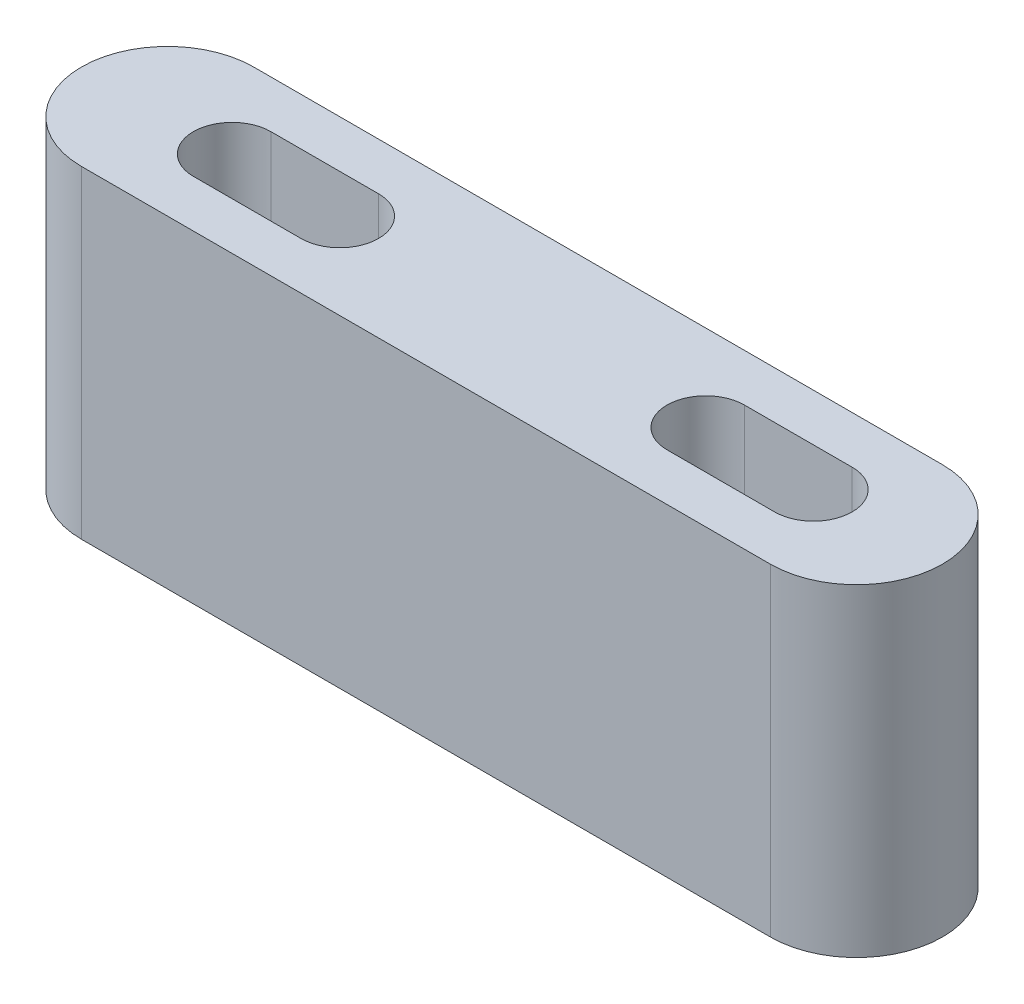
ISO-10303-21;
HEADER;
FILE_DESCRIPTION(('STEP AP214'),'2;1');
FILE_NAME('part.step','',(''),(''),'','','');
FILE_SCHEMA(('AUTOMOTIVE_DESIGN { 1 0 10303 214 1 1 1 1 }'));
ENDSEC;
DATA;
#1=APPLICATION_CONTEXT('core data for automotive mechanical design processes');
#2=APPLICATION_PROTOCOL_DEFINITION('international standard','automotive_design',2000,#1);
#3=PRODUCT_CONTEXT('',#1,'mechanical');
#4=PRODUCT('Part','Part','',(#3));
#5=PRODUCT_RELATED_PRODUCT_CATEGORY('part','',(#4));
#6=PRODUCT_DEFINITION_FORMATION('','',#4);
#7=PRODUCT_DEFINITION_CONTEXT('part definition',#1,'design');
#8=PRODUCT_DEFINITION('design','',#6,#7);
#9=PRODUCT_DEFINITION_SHAPE('','',#8);
#10=(LENGTH_UNIT() NAMED_UNIT(*) SI_UNIT(.MILLI.,.METRE.));
#11=(NAMED_UNIT(*) PLANE_ANGLE_UNIT() SI_UNIT($,.RADIAN.));
#12=(NAMED_UNIT(*) SI_UNIT($,.STERADIAN.) SOLID_ANGLE_UNIT());
#13=UNCERTAINTY_MEASURE_WITH_UNIT(LENGTH_MEASURE(1.E-05),#10,'distance_accuracy_value','');
#14=(GEOMETRIC_REPRESENTATION_CONTEXT(3) GLOBAL_UNCERTAINTY_ASSIGNED_CONTEXT((#13)) GLOBAL_UNIT_ASSIGNED_CONTEXT((#10,
#11,#12)) REPRESENTATION_CONTEXT('',''));
#15=CARTESIAN_POINT('',(0.,0.,0.));
#16=DIRECTION('',(0.,0.,1.));
#17=DIRECTION('',(1.,0.,0.));
#18=AXIS2_PLACEMENT_3D('',#15,#16,#17);
#19=CARTESIAN_POINT('',(0.,15.,-4.));
#20=DIRECTION('',(0.,-1.,0.));
#21=DIRECTION('',(0.,0.,-1.));
#22=AXIS2_PLACEMENT_3D('',#19,#20,#21);
#23=CYLINDRICAL_SURFACE('',#22,4.);
#24=CARTESIAN_POINT('',(0.,0.,-4.));
#25=DIRECTION('',(0.,1.,0.));
#26=DIRECTION('',(0.,0.,1.));
#27=AXIS2_PLACEMENT_3D('',#24,#25,#26);
#28=CIRCLE('',#27,4.);
#29=CARTESIAN_POINT('',(0.,0.,-8.));
#30=VERTEX_POINT('',#29);
#31=CARTESIAN_POINT('',(0.,0.,0.));
#32=VERTEX_POINT('',#31);
#33=EDGE_CURVE('E158',#30,#32,#28,.T.);
#34=ORIENTED_EDGE('',*,*,#33,.T.);
#35=DIRECTION('',(0.,-1.,0.));
#36=VECTOR('',#35,1.);
#37=CARTESIAN_POINT('',(0.,15.,0.));
#38=LINE('',#37,#36);
#39=CARTESIAN_POINT('',(0.,15.,0.));
#40=VERTEX_POINT('',#39);
#41=EDGE_CURVE('E11',#40,#32,#38,.T.);
#42=ORIENTED_EDGE('',*,*,#41,.F.);
#43=CARTESIAN_POINT('',(0.,15.,-4.));
#44=DIRECTION('',(0.,1.,0.));
#45=DIRECTION('',(0.,0.,1.));
#46=AXIS2_PLACEMENT_3D('',#43,#44,#45);
#47=CIRCLE('',#46,4.);
#48=CARTESIAN_POINT('',(0.,15.,-8.));
#49=VERTEX_POINT('',#48);
#50=EDGE_CURVE('E191',#49,#40,#47,.T.);
#51=ORIENTED_EDGE('',*,*,#50,.F.);
#52=DIRECTION('',(0.,-1.,0.));
#53=VECTOR('',#52,1.);
#54=CARTESIAN_POINT('',(0.,15.,-8.));
#55=LINE('',#54,#53);
#56=EDGE_CURVE('E201',#49,#30,#55,.T.);
#57=ORIENTED_EDGE('',*,*,#56,.T.);
#58=EDGE_LOOP('',(#34,#42,#51,#57));
#59=FACE_BOUND('',#58,.T.);
#60=ADVANCED_FACE('F33',(#59),#23,.T.);
#61=CARTESIAN_POINT('',(0.,15.,0.));
#62=DIRECTION('',(0.,0.,-1.));
#63=DIRECTION('',(-1.,0.,0.));
#64=AXIS2_PLACEMENT_3D('',#61,#62,#63);
#65=PLANE('',#64);
#66=DIRECTION('',(1.,0.,0.));
#67=VECTOR('',#66,1.);
#68=CARTESIAN_POINT('',(0.,0.,0.));
#69=LINE('',#68,#67);
#70=CARTESIAN_POINT('',(32.,0.,0.));
#71=VERTEX_POINT('',#70);
#72=EDGE_CURVE('E204',#32,#71,#69,.T.);
#73=ORIENTED_EDGE('',*,*,#72,.T.);
#74=DIRECTION('',(0.,-1.,0.));
#75=VECTOR('',#74,1.);
#76=CARTESIAN_POINT('',(32.,15.,0.));
#77=LINE('',#76,#75);
#78=CARTESIAN_POINT('',(32.,15.,0.));
#79=VERTEX_POINT('',#78);
#80=EDGE_CURVE('E40',#79,#71,#77,.T.);
#81=ORIENTED_EDGE('',*,*,#80,.F.);
#82=DIRECTION('',(1.,0.,0.));
#83=VECTOR('',#82,1.);
#84=CARTESIAN_POINT('',(0.,15.,0.));
#85=LINE('',#84,#83);
#86=EDGE_CURVE('E194',#40,#79,#85,.T.);
#87=ORIENTED_EDGE('',*,*,#86,.F.);
#88=ORIENTED_EDGE('',*,*,#41,.T.);
#89=EDGE_LOOP('',(#73,#81,#87,#88));
#90=FACE_BOUND('',#89,.T.);
#91=ADVANCED_FACE('F233',(#90),#65,.F.);
#92=CARTESIAN_POINT('',(32.,15.,-4.));
#93=DIRECTION('',(0.,-1.,0.));
#94=DIRECTION('',(0.,0.,-1.));
#95=AXIS2_PLACEMENT_3D('',#92,#93,#94);
#96=CYLINDRICAL_SURFACE('',#95,4.);
#97=CARTESIAN_POINT('',(32.,0.,-4.));
#98=DIRECTION('',(0.,1.,0.));
#99=DIRECTION('',(0.,0.,1.));
#100=AXIS2_PLACEMENT_3D('',#97,#98,#99);
#101=CIRCLE('',#100,4.);
#102=CARTESIAN_POINT('',(32.,0.,-8.));
#103=VERTEX_POINT('',#102);
#104=EDGE_CURVE('E206',#71,#103,#101,.T.);
#105=ORIENTED_EDGE('',*,*,#104,.T.);
#106=DIRECTION('',(0.,-1.,0.));
#107=VECTOR('',#106,1.);
#108=CARTESIAN_POINT('',(32.,15.,-8.));
#109=LINE('',#108,#107);
#110=CARTESIAN_POINT('',(32.,15.,-8.));
#111=VERTEX_POINT('',#110);
#112=EDGE_CURVE('E211',#111,#103,#109,.T.);
#113=ORIENTED_EDGE('',*,*,#112,.F.);
#114=CARTESIAN_POINT('',(32.,15.,-4.));
#115=DIRECTION('',(0.,1.,0.));
#116=DIRECTION('',(0.,0.,1.));
#117=AXIS2_PLACEMENT_3D('',#114,#115,#116);
#118=CIRCLE('',#117,4.);
#119=EDGE_CURVE('E197',#79,#111,#118,.T.);
#120=ORIENTED_EDGE('',*,*,#119,.F.);
#121=ORIENTED_EDGE('',*,*,#80,.T.);
#122=EDGE_LOOP('',(#105,#113,#120,#121));
#123=FACE_BOUND('',#122,.T.);
#124=ADVANCED_FACE('F218',(#123),#96,.T.);
#125=CARTESIAN_POINT('',(0.,15.,-8.));
#126=DIRECTION('',(0.,0.,1.));
#127=DIRECTION('',(1.,0.,0.));
#128=AXIS2_PLACEMENT_3D('',#125,#126,#127);
#129=PLANE('',#128);
#130=DIRECTION('',(-1.,0.,0.));
#131=VECTOR('',#130,1.);
#132=CARTESIAN_POINT('',(0.,0.,-8.));
#133=LINE('',#132,#131);
#134=EDGE_CURVE('E195',#103,#30,#133,.T.);
#135=ORIENTED_EDGE('',*,*,#134,.T.);
#136=ORIENTED_EDGE('',*,*,#56,.F.);
#137=DIRECTION('',(-1.,0.,0.));
#138=VECTOR('',#137,1.);
#139=CARTESIAN_POINT('',(0.,15.,-8.));
#140=LINE('',#139,#138);
#141=EDGE_CURVE('E199',#111,#49,#140,.T.);
#142=ORIENTED_EDGE('',*,*,#141,.F.);
#143=ORIENTED_EDGE('',*,*,#112,.T.);
#144=EDGE_LOOP('',(#135,#136,#142,#143));
#145=FACE_BOUND('',#144,.T.);
#146=ADVANCED_FACE('F226',(#145),#129,.F.);
#147=CARTESIAN_POINT('',(0.,15.,-4.));
#148=DIRECTION('',(0.,1.,0.));
#149=DIRECTION('',(0.,0.,1.));
#150=AXIS2_PLACEMENT_3D('',#147,#148,#149);
#151=PLANE('',#150);
#152=CARTESIAN_POINT('',(3.,15.,-4.));
#153=DIRECTION('',(0.,1.,0.));
#154=DIRECTION('',(0.,0.,1.));
#155=AXIS2_PLACEMENT_3D('',#152,#153,#154);
#156=CIRCLE('',#155,1.8);
#157=CARTESIAN_POINT('',(3.,15.,-5.8));
#158=VERTEX_POINT('',#157);
#159=CARTESIAN_POINT('',(3.,15.,-2.2));
#160=VERTEX_POINT('',#159);
#161=EDGE_CURVE('E47',#158,#160,#156,.T.);
#162=ORIENTED_EDGE('',*,*,#161,.F.);
#163=DIRECTION('',(-1.,0.,0.));
#164=VECTOR('',#163,1.);
#165=CARTESIAN_POINT('',(3.,15.,-5.8));
#166=LINE('',#165,#164);
#167=CARTESIAN_POINT('',(8.,15.,-5.8));
#168=VERTEX_POINT('',#167);
#169=EDGE_CURVE('E142',#168,#158,#166,.T.);
#170=ORIENTED_EDGE('',*,*,#169,.F.);
#171=CARTESIAN_POINT('',(8.,15.,-4.));
#172=DIRECTION('',(0.,1.,0.));
#173=DIRECTION('',(0.,0.,1.));
#174=AXIS2_PLACEMENT_3D('',#171,#172,#173);
#175=CIRCLE('',#174,1.8);
#176=CARTESIAN_POINT('',(8.,15.,-2.2));
#177=VERTEX_POINT('',#176);
#178=EDGE_CURVE('E145',#177,#168,#175,.T.);
#179=ORIENTED_EDGE('',*,*,#178,.F.);
#180=DIRECTION('',(1.,0.,0.));
#181=VECTOR('',#180,1.);
#182=CARTESIAN_POINT('',(3.,15.,-2.2));
#183=LINE('',#182,#181);
#184=EDGE_CURVE('E151',#160,#177,#183,.T.);
#185=ORIENTED_EDGE('',*,*,#184,.F.);
#186=EDGE_LOOP('',(#162,#170,#179,#185));
#187=FACE_BOUND('',#186,.T.);
#188=CARTESIAN_POINT('',(25.,15.,-4.));
#189=DIRECTION('',(0.,1.,0.));
#190=DIRECTION('',(0.,0.,1.));
#191=AXIS2_PLACEMENT_3D('',#188,#189,#190);
#192=CIRCLE('',#191,1.8);
#193=CARTESIAN_POINT('',(25.,15.,-5.8));
#194=VERTEX_POINT('',#193);
#195=CARTESIAN_POINT('',(25.,15.,-2.2));
#196=VERTEX_POINT('',#195);
#197=EDGE_CURVE('E55',#194,#196,#192,.T.);
#198=ORIENTED_EDGE('',*,*,#197,.F.);
#199=DIRECTION('',(-1.,0.,0.));
#200=VECTOR('',#199,1.);
#201=CARTESIAN_POINT('',(25.,15.,-5.8));
#202=LINE('',#201,#200);
#203=CARTESIAN_POINT('',(30.,15.,-5.8));
#204=VERTEX_POINT('',#203);
#205=EDGE_CURVE('E166',#204,#194,#202,.T.);
#206=ORIENTED_EDGE('',*,*,#205,.F.);
#207=CARTESIAN_POINT('',(30.,15.,-4.));
#208=DIRECTION('',(0.,1.,0.));
#209=DIRECTION('',(0.,0.,1.));
#210=AXIS2_PLACEMENT_3D('',#207,#208,#209);
#211=CIRCLE('',#210,1.8);
#212=CARTESIAN_POINT('',(30.,15.,-2.2));
#213=VERTEX_POINT('',#212);
#214=EDGE_CURVE('E180',#213,#204,#211,.T.);
#215=ORIENTED_EDGE('',*,*,#214,.F.);
#216=DIRECTION('',(1.,0.,0.));
#217=VECTOR('',#216,1.);
#218=CARTESIAN_POINT('',(25.,15.,-2.2));
#219=LINE('',#218,#217);
#220=EDGE_CURVE('E177',#196,#213,#219,.T.);
#221=ORIENTED_EDGE('',*,*,#220,.F.);
#222=EDGE_LOOP('',(#198,#206,#215,#221));
#223=FACE_BOUND('',#222,.T.);
#224=ORIENTED_EDGE('',*,*,#50,.T.);
#225=ORIENTED_EDGE('',*,*,#86,.T.);
#226=ORIENTED_EDGE('',*,*,#119,.T.);
#227=ORIENTED_EDGE('',*,*,#141,.T.);
#228=EDGE_LOOP('',(#224,#225,#226,#227));
#229=FACE_BOUND('',#228,.T.);
#230=ADVANCED_FACE('F232',(#187,#223,#229),#151,.T.);
#231=CARTESIAN_POINT('',(0.,0.,-4.));
#232=DIRECTION('',(0.,1.,0.));
#233=DIRECTION('',(0.,0.,1.));
#234=AXIS2_PLACEMENT_3D('',#231,#232,#233);
#235=PLANE('',#234);
#236=DIRECTION('',(-1.,0.,0.));
#237=VECTOR('',#236,1.);
#238=CARTESIAN_POINT('',(3.,0.,-5.8));
#239=LINE('',#238,#237);
#240=CARTESIAN_POINT('',(8.,0.,-5.8));
#241=VERTEX_POINT('',#240);
#242=CARTESIAN_POINT('',(3.,0.,-5.8));
#243=VERTEX_POINT('',#242);
#244=EDGE_CURVE('E129',#241,#243,#239,.T.);
#245=ORIENTED_EDGE('',*,*,#244,.T.);
#246=CARTESIAN_POINT('',(3.,0.,-4.));
#247=DIRECTION('',(0.,1.,0.));
#248=DIRECTION('',(0.,0.,1.));
#249=AXIS2_PLACEMENT_3D('',#246,#247,#248);
#250=CIRCLE('',#249,1.8);
#251=CARTESIAN_POINT('',(3.,0.,-2.2));
#252=VERTEX_POINT('',#251);
#253=EDGE_CURVE('E123',#243,#252,#250,.T.);
#254=ORIENTED_EDGE('',*,*,#253,.T.);
#255=DIRECTION('',(1.,0.,0.));
#256=VECTOR('',#255,1.);
#257=CARTESIAN_POINT('',(3.,0.,-2.2));
#258=LINE('',#257,#256);
#259=CARTESIAN_POINT('',(8.,0.,-2.2));
#260=VERTEX_POINT('',#259);
#261=EDGE_CURVE('E133',#252,#260,#258,.T.);
#262=ORIENTED_EDGE('',*,*,#261,.T.);
#263=CARTESIAN_POINT('',(8.,0.,-4.));
#264=DIRECTION('',(0.,1.,0.));
#265=DIRECTION('',(0.,0.,1.));
#266=AXIS2_PLACEMENT_3D('',#263,#264,#265);
#267=CIRCLE('',#266,1.8);
#268=EDGE_CURVE('E137',#260,#241,#267,.T.);
#269=ORIENTED_EDGE('',*,*,#268,.T.);
#270=EDGE_LOOP('',(#245,#254,#262,#269));
#271=FACE_BOUND('',#270,.T.);
#272=DIRECTION('',(-1.,0.,0.));
#273=VECTOR('',#272,1.);
#274=CARTESIAN_POINT('',(25.,0.,-5.8));
#275=LINE('',#274,#273);
#276=CARTESIAN_POINT('',(30.,0.,-5.8));
#277=VERTEX_POINT('',#276);
#278=CARTESIAN_POINT('',(25.,0.,-5.8));
#279=VERTEX_POINT('',#278);
#280=EDGE_CURVE('E172',#277,#279,#275,.T.);
#281=ORIENTED_EDGE('',*,*,#280,.T.);
#282=CARTESIAN_POINT('',(25.,0.,-4.));
#283=DIRECTION('',(0.,1.,0.));
#284=DIRECTION('',(0.,0.,1.));
#285=AXIS2_PLACEMENT_3D('',#282,#283,#284);
#286=CIRCLE('',#285,1.8);
#287=CARTESIAN_POINT('',(25.,0.,-2.2));
#288=VERTEX_POINT('',#287);
#289=EDGE_CURVE('E162',#279,#288,#286,.T.);
#290=ORIENTED_EDGE('',*,*,#289,.T.);
#291=DIRECTION('',(1.,0.,0.));
#292=VECTOR('',#291,1.);
#293=CARTESIAN_POINT('',(25.,0.,-2.2));
#294=LINE('',#293,#292);
#295=CARTESIAN_POINT('',(30.,0.,-2.2));
#296=VERTEX_POINT('',#295);
#297=EDGE_CURVE('E165',#288,#296,#294,.T.);
#298=ORIENTED_EDGE('',*,*,#297,.T.);
#299=CARTESIAN_POINT('',(30.,0.,-4.));
#300=DIRECTION('',(0.,1.,0.));
#301=DIRECTION('',(0.,0.,1.));
#302=AXIS2_PLACEMENT_3D('',#299,#300,#301);
#303=CIRCLE('',#302,1.8);
#304=EDGE_CURVE('E169',#296,#277,#303,.T.);
#305=ORIENTED_EDGE('',*,*,#304,.T.);
#306=EDGE_LOOP('',(#281,#290,#298,#305));
#307=FACE_BOUND('',#306,.T.);
#308=ORIENTED_EDGE('',*,*,#33,.F.);
#309=ORIENTED_EDGE('',*,*,#134,.F.);
#310=ORIENTED_EDGE('',*,*,#104,.F.);
#311=ORIENTED_EDGE('',*,*,#72,.F.);
#312=EDGE_LOOP('',(#308,#309,#310,#311));
#313=FACE_BOUND('',#312,.T.);
#314=ADVANCED_FACE('F139',(#271,#307,#313),#235,.F.);
#315=CARTESIAN_POINT('',(25.,0.,-4.));
#316=DIRECTION('',(0.,1.,0.));
#317=DIRECTION('',(0.,0.,1.));
#318=AXIS2_PLACEMENT_3D('',#315,#316,#317);
#319=CYLINDRICAL_SURFACE('',#318,1.8);
#320=ORIENTED_EDGE('',*,*,#197,.T.);
#321=DIRECTION('',(0.,1.,0.));
#322=VECTOR('',#321,1.);
#323=CARTESIAN_POINT('',(25.,0.,-2.2));
#324=LINE('',#323,#322);
#325=EDGE_CURVE('E175',#288,#196,#324,.T.);
#326=ORIENTED_EDGE('',*,*,#325,.F.);
#327=ORIENTED_EDGE('',*,*,#289,.F.);
#328=DIRECTION('',(0.,1.,0.));
#329=VECTOR('',#328,1.);
#330=CARTESIAN_POINT('',(25.,0.,-5.8));
#331=LINE('',#330,#329);
#332=EDGE_CURVE('E152',#279,#194,#331,.T.);
#333=ORIENTED_EDGE('',*,*,#332,.T.);
#334=EDGE_LOOP('',(#320,#326,#327,#333));
#335=FACE_BOUND('',#334,.T.);
#336=ADVANCED_FACE('F245',(#335),#319,.F.);
#337=CARTESIAN_POINT('',(25.,0.,-5.8));
#338=DIRECTION('',(0.,0.,-1.));
#339=DIRECTION('',(-1.,0.,0.));
#340=AXIS2_PLACEMENT_3D('',#337,#338,#339);
#341=PLANE('',#340);
#342=ORIENTED_EDGE('',*,*,#205,.T.);
#343=ORIENTED_EDGE('',*,*,#332,.F.);
#344=ORIENTED_EDGE('',*,*,#280,.F.);
#345=DIRECTION('',(0.,1.,0.));
#346=VECTOR('',#345,1.);
#347=CARTESIAN_POINT('',(30.,0.,-5.8));
#348=LINE('',#347,#346);
#349=EDGE_CURVE('E186',#277,#204,#348,.T.);
#350=ORIENTED_EDGE('',*,*,#349,.T.);
#351=EDGE_LOOP('',(#342,#343,#344,#350));
#352=FACE_BOUND('',#351,.T.);
#353=ADVANCED_FACE('F251',(#352),#341,.F.);
#354=CARTESIAN_POINT('',(30.,0.,-4.));
#355=DIRECTION('',(0.,1.,0.));
#356=DIRECTION('',(0.,0.,1.));
#357=AXIS2_PLACEMENT_3D('',#354,#355,#356);
#358=CYLINDRICAL_SURFACE('',#357,1.8);
#359=ORIENTED_EDGE('',*,*,#214,.T.);
#360=ORIENTED_EDGE('',*,*,#349,.F.);
#361=ORIENTED_EDGE('',*,*,#304,.F.);
#362=DIRECTION('',(0.,1.,0.));
#363=VECTOR('',#362,1.);
#364=CARTESIAN_POINT('',(30.,0.,-2.2));
#365=LINE('',#364,#363);
#366=EDGE_CURVE('E188',#296,#213,#365,.T.);
#367=ORIENTED_EDGE('',*,*,#366,.T.);
#368=EDGE_LOOP('',(#359,#360,#361,#367));
#369=FACE_BOUND('',#368,.T.);
#370=ADVANCED_FACE('F255',(#369),#358,.F.);
#371=CARTESIAN_POINT('',(25.,0.,-2.2));
#372=DIRECTION('',(0.,0.,1.));
#373=DIRECTION('',(1.,0.,0.));
#374=AXIS2_PLACEMENT_3D('',#371,#372,#373);
#375=PLANE('',#374);
#376=ORIENTED_EDGE('',*,*,#220,.T.);
#377=ORIENTED_EDGE('',*,*,#366,.F.);
#378=ORIENTED_EDGE('',*,*,#297,.F.);
#379=ORIENTED_EDGE('',*,*,#325,.T.);
#380=EDGE_LOOP('',(#376,#377,#378,#379));
#381=FACE_BOUND('',#380,.T.);
#382=ADVANCED_FACE('F252',(#381),#375,.F.);
#383=CARTESIAN_POINT('',(3.,0.,-4.));
#384=DIRECTION('',(0.,1.,0.));
#385=DIRECTION('',(0.,0.,1.));
#386=AXIS2_PLACEMENT_3D('',#383,#384,#385);
#387=CYLINDRICAL_SURFACE('',#386,1.8);
#388=ORIENTED_EDGE('',*,*,#161,.T.);
#389=DIRECTION('',(0.,1.,0.));
#390=VECTOR('',#389,1.);
#391=CARTESIAN_POINT('',(3.,0.,-2.2));
#392=LINE('',#391,#390);
#393=EDGE_CURVE('E119',#252,#160,#392,.T.);
#394=ORIENTED_EDGE('',*,*,#393,.F.);
#395=ORIENTED_EDGE('',*,*,#253,.F.);
#396=DIRECTION('',(0.,1.,0.));
#397=VECTOR('',#396,1.);
#398=CARTESIAN_POINT('',(3.,0.,-5.8));
#399=LINE('',#398,#397);
#400=EDGE_CURVE('E156',#243,#158,#399,.T.);
#401=ORIENTED_EDGE('',*,*,#400,.T.);
#402=EDGE_LOOP('',(#388,#394,#395,#401));
#403=FACE_BOUND('',#402,.T.);
#404=ADVANCED_FACE('F121',(#403),#387,.F.);
#405=CARTESIAN_POINT('',(3.,0.,-5.8));
#406=DIRECTION('',(0.,0.,-1.));
#407=DIRECTION('',(-1.,0.,0.));
#408=AXIS2_PLACEMENT_3D('',#405,#406,#407);
#409=PLANE('',#408);
#410=ORIENTED_EDGE('',*,*,#169,.T.);
#411=ORIENTED_EDGE('',*,*,#400,.F.);
#412=ORIENTED_EDGE('',*,*,#244,.F.);
#413=DIRECTION('',(0.,1.,0.));
#414=VECTOR('',#413,1.);
#415=CARTESIAN_POINT('',(8.,0.,-5.8));
#416=LINE('',#415,#414);
#417=EDGE_CURVE('E159',#241,#168,#416,.T.);
#418=ORIENTED_EDGE('',*,*,#417,.T.);
#419=EDGE_LOOP('',(#410,#411,#412,#418));
#420=FACE_BOUND('',#419,.T.);
#421=ADVANCED_FACE('F265',(#420),#409,.F.);
#422=CARTESIAN_POINT('',(8.,0.,-4.));
#423=DIRECTION('',(0.,1.,0.));
#424=DIRECTION('',(0.,0.,1.));
#425=AXIS2_PLACEMENT_3D('',#422,#423,#424);
#426=CYLINDRICAL_SURFACE('',#425,1.8);
#427=ORIENTED_EDGE('',*,*,#178,.T.);
#428=ORIENTED_EDGE('',*,*,#417,.F.);
#429=ORIENTED_EDGE('',*,*,#268,.F.);
#430=DIRECTION('',(0.,1.,0.));
#431=VECTOR('',#430,1.);
#432=CARTESIAN_POINT('',(8.,0.,-2.2));
#433=LINE('',#432,#431);
#434=EDGE_CURVE('E128',#260,#177,#433,.T.);
#435=ORIENTED_EDGE('',*,*,#434,.T.);
#436=EDGE_LOOP('',(#427,#428,#429,#435));
#437=FACE_BOUND('',#436,.T.);
#438=ADVANCED_FACE('F268',(#437),#426,.F.);
#439=CARTESIAN_POINT('',(3.,0.,-2.2));
#440=DIRECTION('',(0.,0.,1.));
#441=DIRECTION('',(1.,0.,0.));
#442=AXIS2_PLACEMENT_3D('',#439,#440,#441);
#443=PLANE('',#442);
#444=ORIENTED_EDGE('',*,*,#184,.T.);
#445=ORIENTED_EDGE('',*,*,#434,.F.);
#446=ORIENTED_EDGE('',*,*,#261,.F.);
#447=ORIENTED_EDGE('',*,*,#393,.T.);
#448=EDGE_LOOP('',(#444,#445,#446,#447));
#449=FACE_BOUND('',#448,.T.);
#450=ADVANCED_FACE('F134',(#449),#443,.F.);
#451=CLOSED_SHELL('',(#60,#91,#124,#146,#230,#314,#336,#353,#370,#382,#404,#421,#438,#450));
#452=MANIFOLD_SOLID_BREP('B2',#451);
#453=ADVANCED_BREP_SHAPE_REPRESENTATION('',(#18,#452),#14);
#454=SHAPE_DEFINITION_REPRESENTATION(#9,#453);
ENDSEC;
END-ISO-10303-21;
